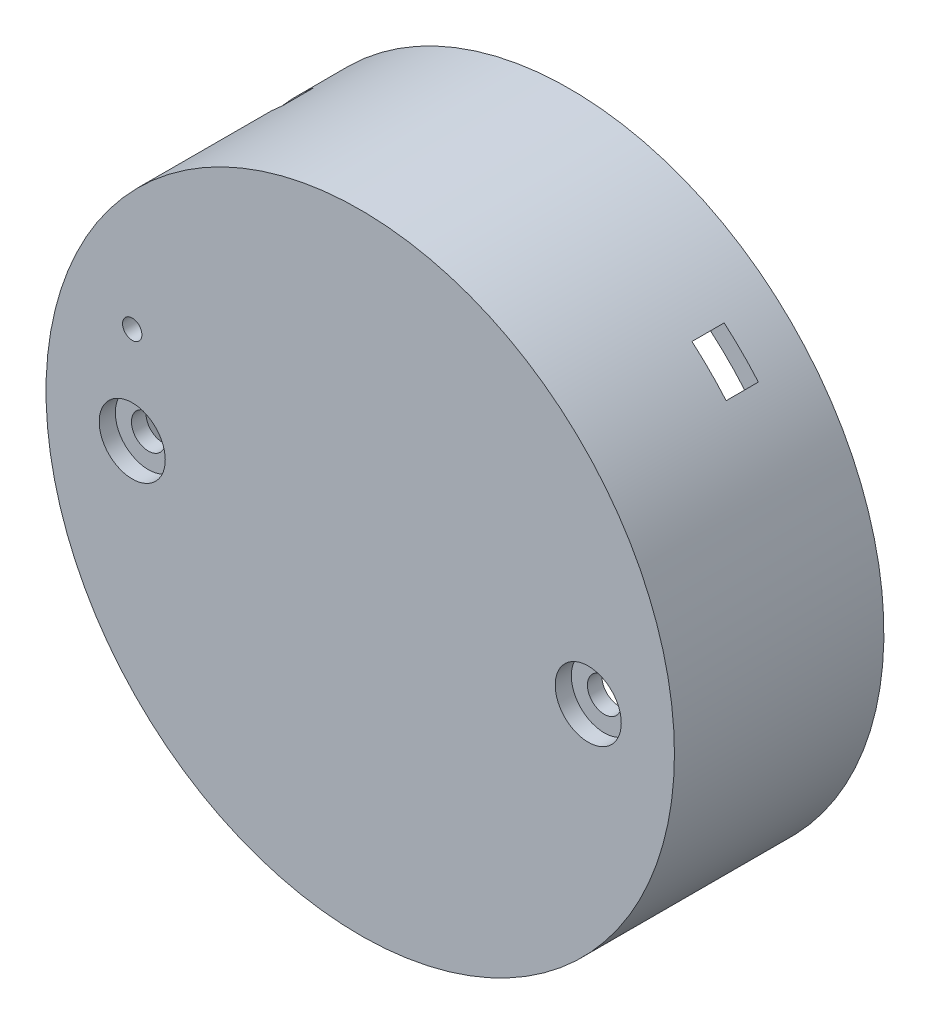
ISO-10303-21;
HEADER;
FILE_DESCRIPTION(('STEP AP214'),'2;1');
FILE_NAME('part.step','',(''),(''),'','','');
FILE_SCHEMA(('AUTOMOTIVE_DESIGN { 1 0 10303 214 1 1 1 1 }'));
ENDSEC;
DATA;
#1=APPLICATION_CONTEXT('core data for automotive mechanical design processes');
#2=APPLICATION_PROTOCOL_DEFINITION('international standard','automotive_design',2000,#1);
#3=PRODUCT_CONTEXT('',#1,'mechanical');
#4=PRODUCT('Part','Part','',(#3));
#5=PRODUCT_RELATED_PRODUCT_CATEGORY('part','',(#4));
#6=PRODUCT_DEFINITION_FORMATION('','',#4);
#7=PRODUCT_DEFINITION_CONTEXT('part definition',#1,'design');
#8=PRODUCT_DEFINITION('design','',#6,#7);
#9=PRODUCT_DEFINITION_SHAPE('','',#8);
#10=(LENGTH_UNIT() NAMED_UNIT(*) SI_UNIT(.MILLI.,.METRE.));
#11=(NAMED_UNIT(*) PLANE_ANGLE_UNIT() SI_UNIT($,.RADIAN.));
#12=(NAMED_UNIT(*) SI_UNIT($,.STERADIAN.) SOLID_ANGLE_UNIT());
#13=UNCERTAINTY_MEASURE_WITH_UNIT(LENGTH_MEASURE(1.E-05),#10,'distance_accuracy_value','');
#14=(GEOMETRIC_REPRESENTATION_CONTEXT(3) GLOBAL_UNCERTAINTY_ASSIGNED_CONTEXT((#13)) GLOBAL_UNIT_ASSIGNED_CONTEXT((#10,
#11,#12)) REPRESENTATION_CONTEXT('',''));
#15=CARTESIAN_POINT('',(0.,0.,0.));
#16=DIRECTION('',(0.,0.,1.));
#17=DIRECTION('',(1.,0.,0.));
#18=AXIS2_PLACEMENT_3D('',#15,#16,#17);
#19=CARTESIAN_POINT('',(5.21028005740604,9.53796523775199,13.));
#20=DIRECTION('',(0.,0.,-1.));
#21=DIRECTION('',(-1.,0.,0.));
#22=AXIS2_PLACEMENT_3D('',#19,#20,#21);
#23=CYLINDRICAL_SURFACE('',#22,19.5);
#24=CARTESIAN_POINT('',(5.21028005740604,9.53796523775199,5.1));
#25=DIRECTION('',(0.,0.,-1.));
#26=DIRECTION('',(-1.,0.,0.));
#27=AXIS2_PLACEMENT_3D('',#24,#25,#26);
#28=CIRCLE('',#27,19.5);
#29=CARTESIAN_POINT('',(-9.59810719924123,22.2250321508398,5.1));
#30=VERTEX_POINT('',#29);
#31=CARTESIAN_POINT('',(-7.47678685568157,24.3463524943994,5.1));
#32=VERTEX_POINT('',#31);
#33=EDGE_CURVE('E163',#30,#32,#28,.T.);
#34=ORIENTED_EDGE('',*,*,#33,.F.);
#35=DIRECTION('',(0.,0.,-1.));
#36=VECTOR('',#35,1.);
#37=CARTESIAN_POINT('',(-9.59810719924122,22.2250321508398,13.));
#38=LINE('',#37,#36);
#39=CARTESIAN_POINT('',(-9.59810719924123,22.2250321508398,3.1));
#40=VERTEX_POINT('',#39);
#41=EDGE_CURVE('E169',#40,#30,#38,.F.);
#42=ORIENTED_EDGE('',*,*,#41,.F.);
#43=CARTESIAN_POINT('',(5.21028005740604,9.53796523775199,3.1));
#44=DIRECTION('',(0.,0.,-1.));
#45=DIRECTION('',(-1.,0.,0.));
#46=AXIS2_PLACEMENT_3D('',#43,#44,#45);
#47=CIRCLE('',#46,19.5);
#48=CARTESIAN_POINT('',(-7.47678685568157,24.3463524943994,3.1));
#49=VERTEX_POINT('',#48);
#50=EDGE_CURVE('E154',#40,#49,#47,.T.);
#51=ORIENTED_EDGE('',*,*,#50,.T.);
#52=DIRECTION('',(0.,0.,-1.));
#53=VECTOR('',#52,1.);
#54=CARTESIAN_POINT('',(-7.47678685568157,24.3463524943994,13.));
#55=LINE('',#54,#53);
#56=EDGE_CURVE('E180',#49,#32,#55,.F.);
#57=ORIENTED_EDGE('',*,*,#56,.T.);
#58=EDGE_LOOP('',(#34,#42,#51,#57));
#59=FACE_BOUND('',#58,.T.);
#60=DIRECTION('',(0.,0.,-1.));
#61=VECTOR('',#60,1.);
#62=CARTESIAN_POINT('',(0.835300292869349,-9.46491749250487,13.));
#63=LINE('',#62,#61);
#64=CARTESIAN_POINT('',(0.835300292869347,-9.46491749250487,3.1));
#65=VERTEX_POINT('',#64);
#66=CARTESIAN_POINT('',(0.835300292869347,-9.46491749250487,6.35));
#67=VERTEX_POINT('',#66);
#68=EDGE_CURVE('E221',#65,#67,#63,.F.);
#69=ORIENTED_EDGE('',*,*,#68,.T.);
#70=CARTESIAN_POINT('',(5.21028005740604,9.53796523775199,6.35));
#71=DIRECTION('',(0.,0.,1.));
#72=DIRECTION('',(1.,0.,0.));
#73=AXIS2_PLACEMENT_3D('',#70,#71,#72);
#74=CIRCLE('',#73,19.5);
#75=CARTESIAN_POINT('',(9.58530029286935,-9.4649081749529,6.35));
#76=VERTEX_POINT('',#75);
#77=EDGE_CURVE('E218',#67,#76,#74,.T.);
#78=ORIENTED_EDGE('',*,*,#77,.T.);
#79=DIRECTION('',(0.,0.,-1.));
#80=VECTOR('',#79,1.);
#81=CARTESIAN_POINT('',(9.58530029286935,-9.4649081749529,13.));
#82=LINE('',#81,#80);
#83=CARTESIAN_POINT('',(9.58530029286935,-9.4649081749529,3.1));
#84=VERTEX_POINT('',#83);
#85=EDGE_CURVE('E225',#76,#84,#82,.T.);
#86=ORIENTED_EDGE('',*,*,#85,.T.);
#87=CARTESIAN_POINT('',(5.21028005740604,9.53796523775199,3.1));
#88=DIRECTION('',(0.,0.,1.));
#89=DIRECTION('',(1.,0.,0.));
#90=AXIS2_PLACEMENT_3D('',#87,#88,#89);
#91=CIRCLE('',#90,19.5);
#92=EDGE_CURVE('E209',#65,#84,#91,.T.);
#93=ORIENTED_EDGE('',*,*,#92,.F.);
#94=EDGE_LOOP('',(#69,#78,#86,#93));
#95=FACE_BOUND('',#94,.T.);
#96=CARTESIAN_POINT('',(5.21028005740604,9.53796523775199,13.));
#97=DIRECTION('',(0.,0.,1.));
#98=DIRECTION('',(1.,0.,0.));
#99=AXIS2_PLACEMENT_3D('',#96,#97,#98);
#100=CIRCLE('',#99,19.5);
#101=CARTESIAN_POINT('',(24.710280057406,9.53796523775199,13.));
#102=VERTEX_POINT('',#101);
#103=EDGE_CURVE('E475',#102,#102,#100,.T.);
#104=ORIENTED_EDGE('',*,*,#103,.F.);
#105=EDGE_LOOP('',(#104));
#106=FACE_BOUND('',#105,.T.);
#107=DIRECTION('',(0.,0.,-1.));
#108=VECTOR('',#107,1.);
#109=CARTESIAN_POINT('',(12.6846624627935,-8.47268737835367,1.5));
#110=LINE('',#109,#108);
#111=CARTESIAN_POINT('',(12.6846625511473,-8.47268740675363,0.));
#112=VERTEX_POINT('',#111);
#113=CARTESIAN_POINT('',(12.6846906677821,-8.47267567205894,1.5));
#114=VERTEX_POINT('',#113);
#115=EDGE_CURVE('E469',#112,#114,#110,.F.);
#116=ORIENTED_EDGE('',*,*,#115,.F.);
#117=CARTESIAN_POINT('',(5.21028005740604,9.53796523775199,0.));
#118=DIRECTION('',(0.,0.,1.));
#119=DIRECTION('',(1.,0.,0.));
#120=AXIS2_PLACEMENT_3D('',#117,#118,#119);
#121=CIRCLE('',#120,19.5);
#122=CARTESIAN_POINT('',(-2.26412115006537,-8.47267957551746,0.));
#123=VERTEX_POINT('',#122);
#124=EDGE_CURVE('E472',#112,#123,#121,.T.);
#125=ORIENTED_EDGE('',*,*,#124,.T.);
#126=DIRECTION('',(0.,0.,-1.));
#127=VECTOR('',#126,1.);
#128=CARTESIAN_POINT('',(-2.2641023477453,-8.4726873784516,1.5));
#129=LINE('',#128,#127);
#130=CARTESIAN_POINT('',(-2.2641024844062,-8.47268725665163,1.5));
#131=VERTEX_POINT('',#130);
#132=EDGE_CURVE('E301',#131,#123,#129,.T.);
#133=ORIENTED_EDGE('',*,*,#132,.F.);
#134=CARTESIAN_POINT('',(5.21028005740604,9.53796523775199,1.5));
#135=DIRECTION('',(0.,0.,1.));
#136=DIRECTION('',(1.,0.,0.));
#137=AXIS2_PLACEMENT_3D('',#134,#135,#136);
#138=CIRCLE('',#137,19.5);
#139=EDGE_CURVE('E328',#131,#114,#138,.T.);
#140=ORIENTED_EDGE('',*,*,#139,.T.);
#141=EDGE_LOOP('',(#116,#125,#133,#140));
#142=FACE_BOUND('',#141,.T.);
#143=CARTESIAN_POINT('',(5.21028005740604,9.53796523775199,5.1));
#144=DIRECTION('',(0.,0.,-1.));
#145=DIRECTION('',(-1.,0.,0.));
#146=AXIS2_PLACEMENT_3D('',#143,#144,#145);
#147=CIRCLE('',#146,19.5);
#148=CARTESIAN_POINT('',(17.8973469704938,24.3463524943993,5.1));
#149=VERTEX_POINT('',#148);
#150=CARTESIAN_POINT('',(20.0186673140535,22.2250321508396,5.1));
#151=VERTEX_POINT('',#150);
#152=EDGE_CURVE('E185',#149,#151,#147,.T.);
#153=ORIENTED_EDGE('',*,*,#152,.F.);
#154=DIRECTION('',(0.,0.,-1.));
#155=VECTOR('',#154,1.);
#156=CARTESIAN_POINT('',(17.8973469704938,24.3463524943993,13.));
#157=LINE('',#156,#155);
#158=CARTESIAN_POINT('',(17.8973469704938,24.3463524943993,3.1));
#159=VERTEX_POINT('',#158);
#160=EDGE_CURVE('E196',#159,#149,#157,.F.);
#161=ORIENTED_EDGE('',*,*,#160,.F.);
#162=CARTESIAN_POINT('',(5.21028005740604,9.53796523775199,3.1));
#163=DIRECTION('',(0.,0.,-1.));
#164=DIRECTION('',(-1.,0.,0.));
#165=AXIS2_PLACEMENT_3D('',#162,#163,#164);
#166=CIRCLE('',#165,19.5);
#167=CARTESIAN_POINT('',(20.0186673140535,22.2250321508396,3.1));
#168=VERTEX_POINT('',#167);
#169=EDGE_CURVE('E179',#159,#168,#166,.T.);
#170=ORIENTED_EDGE('',*,*,#169,.T.);
#171=DIRECTION('',(0.,0.,-1.));
#172=VECTOR('',#171,1.);
#173=CARTESIAN_POINT('',(20.0186673140535,22.2250321508396,13.));
#174=LINE('',#173,#172);
#175=EDGE_CURVE('E192',#168,#151,#174,.F.);
#176=ORIENTED_EDGE('',*,*,#175,.T.);
#177=EDGE_LOOP('',(#153,#161,#170,#176));
#178=FACE_BOUND('',#177,.T.);
#179=ADVANCED_FACE('F43',(#59,#95,#106,#142,#178),#23,.T.);
#180=CARTESIAN_POINT('',(5.21028005740604,9.53796523775199,1.5));
#181=DIRECTION('',(0.,0.,-1.));
#182=DIRECTION('',(-1.,0.,0.));
#183=AXIS2_PLACEMENT_3D('',#180,#181,#182);
#184=CYLINDRICAL_SURFACE('',#183,18.300000000007);
#185=CARTESIAN_POINT('',(5.21028005740604,9.53796523775199,6.35));
#186=DIRECTION('',(0.,0.,1.));
#187=DIRECTION('',(1.,0.,0.));
#188=AXIS2_PLACEMENT_3D('',#185,#186,#187);
#189=CIRCLE('',#188,18.300000000007);
#190=CARTESIAN_POINT('',(0.835300292869348,-8.23137780188093,6.35));
#191=VERTEX_POINT('',#190);
#192=CARTESIAN_POINT('',(9.58530029286935,-8.2313678375084,6.35));
#193=VERTEX_POINT('',#192);
#194=EDGE_CURVE('E363',#191,#193,#189,.T.);
#195=ORIENTED_EDGE('',*,*,#194,.F.);
#196=DIRECTION('',(0.,0.,-1.));
#197=VECTOR('',#196,1.);
#198=CARTESIAN_POINT('',(0.835300292869349,-8.23137780188093,1.5));
#199=LINE('',#198,#197);
#200=CARTESIAN_POINT('',(0.835300292869348,-8.23137780188093,3.1));
#201=VERTEX_POINT('',#200);
#202=EDGE_CURVE('E402',#201,#191,#199,.F.);
#203=ORIENTED_EDGE('',*,*,#202,.F.);
#204=CARTESIAN_POINT('',(5.21028005740604,9.53796523775199,3.1));
#205=DIRECTION('',(0.,0.,1.));
#206=DIRECTION('',(1.,0.,0.));
#207=AXIS2_PLACEMENT_3D('',#204,#205,#206);
#208=CIRCLE('',#207,18.300000000007);
#209=CARTESIAN_POINT('',(9.58530029286935,-8.2313678375084,3.1));
#210=VERTEX_POINT('',#209);
#211=EDGE_CURVE('E405',#201,#210,#208,.T.);
#212=ORIENTED_EDGE('',*,*,#211,.T.);
#213=DIRECTION('',(0.,0.,-1.));
#214=VECTOR('',#213,1.);
#215=CARTESIAN_POINT('',(9.58530029286935,-8.2313678375084,1.5));
#216=LINE('',#215,#214);
#217=EDGE_CURVE('E398',#193,#210,#216,.T.);
#218=ORIENTED_EDGE('',*,*,#217,.F.);
#219=EDGE_LOOP('',(#195,#203,#212,#218));
#220=FACE_BOUND('',#219,.T.);
#221=CARTESIAN_POINT('',(5.21028005740604,9.53796523775199,0.));
#222=DIRECTION('',(0.,0.,1.));
#223=DIRECTION('',(1.,0.,0.));
#224=AXIS2_PLACEMENT_3D('',#221,#222,#223);
#225=CIRCLE('',#224,18.300000000007);
#226=CARTESIAN_POINT('',(14.268164981837,-6.36312657054919,0.));
#227=VERTEX_POINT('',#226);
#228=CARTESIAN_POINT('',(-3.84760486638226,-6.36312657091527,0.));
#229=VERTEX_POINT('',#228);
#230=EDGE_CURVE('E266',#227,#229,#225,.T.);
#231=ORIENTED_EDGE('',*,*,#230,.F.);
#232=DIRECTION('',(0.,0.,-1.));
#233=VECTOR('',#232,1.);
#234=CARTESIAN_POINT('',(14.2693242463919,-6.3624661520644,1.5));
#235=LINE('',#234,#233);
#236=CARTESIAN_POINT('',(14.2685778762058,-6.36289130851979,1.5));
#237=VERTEX_POINT('',#236);
#238=EDGE_CURVE('E260',#237,#227,#235,.T.);
#239=ORIENTED_EDGE('',*,*,#238,.F.);
#240=CARTESIAN_POINT('',(5.21028005740604,9.53796523775199,1.5));
#241=DIRECTION('',(0.,0.,1.));
#242=DIRECTION('',(1.,0.,0.));
#243=AXIS2_PLACEMENT_3D('',#240,#241,#242);
#244=CIRCLE('',#243,18.300000000007);
#245=CARTESIAN_POINT('',(-3.8484869025287,-6.36262407108765,1.5));
#246=VERTEX_POINT('',#245);
#247=EDGE_CURVE('E256',#237,#246,#244,.F.);
#248=ORIENTED_EDGE('',*,*,#247,.T.);
#249=DIRECTION('',(0.,0.,-1.));
#250=VECTOR('',#249,1.);
#251=CARTESIAN_POINT('',(-3.84876413053498,-6.36246615265967,1.5));
#252=LINE('',#251,#250);
#253=EDGE_CURVE('E409',#229,#246,#252,.F.);
#254=ORIENTED_EDGE('',*,*,#253,.F.);
#255=EDGE_LOOP('',(#231,#239,#248,#254));
#256=FACE_BOUND('',#255,.T.);
#257=CARTESIAN_POINT('',(5.21028005740604,9.53796523775199,11.1));
#258=DIRECTION('',(0.,0.,1.));
#259=DIRECTION('',(1.,0.,0.));
#260=AXIS2_PLACEMENT_3D('',#257,#258,#259);
#261=CIRCLE('',#260,18.300000000007);
#262=CARTESIAN_POINT('',(23.510280057413,9.53796523775199,11.1));
#263=VERTEX_POINT('',#262);
#264=EDGE_CURVE('E252',#263,#263,#261,.T.);
#265=ORIENTED_EDGE('',*,*,#264,.T.);
#266=EDGE_LOOP('',(#265));
#267=FACE_BOUND('',#266,.T.);
#268=DIRECTION('',(0.,0.,-1.));
#269=VECTOR('',#268,1.);
#270=CARTESIAN_POINT('',(-8.74689127050149,21.3738162221,1.5));
#271=LINE('',#270,#269);
#272=CARTESIAN_POINT('',(-8.74689127050149,21.3738162221,3.1));
#273=VERTEX_POINT('',#272);
#274=CARTESIAN_POINT('',(-8.74689127050149,21.3738162221,5.1));
#275=VERTEX_POINT('',#274);
#276=EDGE_CURVE('E172',#273,#275,#271,.F.);
#277=ORIENTED_EDGE('',*,*,#276,.T.);
#278=CARTESIAN_POINT('',(5.21028005740604,9.53796523775199,5.1));
#279=DIRECTION('',(0.,0.,-1.));
#280=DIRECTION('',(-1.,0.,0.));
#281=AXIS2_PLACEMENT_3D('',#278,#279,#280);
#282=CIRCLE('',#281,18.300000000007);
#283=CARTESIAN_POINT('',(-6.62557092694184,23.4951365656597,5.1));
#284=VERTEX_POINT('',#283);
#285=EDGE_CURVE('E385',#275,#284,#282,.T.);
#286=ORIENTED_EDGE('',*,*,#285,.T.);
#287=DIRECTION('',(0.,0.,-1.));
#288=VECTOR('',#287,1.);
#289=CARTESIAN_POINT('',(-6.62557092694184,23.4951365656597,1.5));
#290=LINE('',#289,#288);
#291=CARTESIAN_POINT('',(-6.62557092694184,23.4951365656597,3.1));
#292=VERTEX_POINT('',#291);
#293=EDGE_CURVE('E390',#292,#284,#290,.F.);
#294=ORIENTED_EDGE('',*,*,#293,.F.);
#295=CARTESIAN_POINT('',(5.21028005740604,9.53796523775199,3.1));
#296=DIRECTION('',(0.,0.,-1.));
#297=DIRECTION('',(-1.,0.,0.));
#298=AXIS2_PLACEMENT_3D('',#295,#296,#297);
#299=CIRCLE('',#298,18.300000000007);
#300=EDGE_CURVE('E393',#273,#292,#299,.T.);
#301=ORIENTED_EDGE('',*,*,#300,.F.);
#302=EDGE_LOOP('',(#277,#286,#294,#301));
#303=FACE_BOUND('',#302,.T.);
#304=DIRECTION('',(0.,0.,-1.));
#305=VECTOR('',#304,1.);
#306=CARTESIAN_POINT('',(17.0461310417541,23.4951365656595,1.5));
#307=LINE('',#306,#305);
#308=CARTESIAN_POINT('',(17.0461310417541,23.4951365656595,3.1));
#309=VERTEX_POINT('',#308);
#310=CARTESIAN_POINT('',(17.0461310417541,23.4951365656595,5.1));
#311=VERTEX_POINT('',#310);
#312=EDGE_CURVE('E51',#309,#311,#307,.F.);
#313=ORIENTED_EDGE('',*,*,#312,.T.);
#314=CARTESIAN_POINT('',(5.21028005740604,9.53796523775199,5.1));
#315=DIRECTION('',(0.,0.,-1.));
#316=DIRECTION('',(-1.,0.,0.));
#317=AXIS2_PLACEMENT_3D('',#314,#315,#316);
#318=CIRCLE('',#317,18.300000000007);
#319=CARTESIAN_POINT('',(19.1674513853137,21.3738162220999,5.1));
#320=VERTEX_POINT('',#319);
#321=EDGE_CURVE('E11',#311,#320,#318,.T.);
#322=ORIENTED_EDGE('',*,*,#321,.T.);
#323=DIRECTION('',(0.,0.,-1.));
#324=VECTOR('',#323,1.);
#325=CARTESIAN_POINT('',(19.1674513853137,21.3738162220999,1.5));
#326=LINE('',#325,#324);
#327=CARTESIAN_POINT('',(19.1674513853137,21.3738162220999,3.1));
#328=VERTEX_POINT('',#327);
#329=EDGE_CURVE('E379',#328,#320,#326,.F.);
#330=ORIENTED_EDGE('',*,*,#329,.F.);
#331=CARTESIAN_POINT('',(5.21028005740604,9.53796523775199,3.1));
#332=DIRECTION('',(0.,0.,-1.));
#333=DIRECTION('',(-1.,0.,0.));
#334=AXIS2_PLACEMENT_3D('',#331,#332,#333);
#335=CIRCLE('',#334,18.300000000007);
#336=EDGE_CURVE('E374',#309,#328,#335,.T.);
#337=ORIENTED_EDGE('',*,*,#336,.F.);
#338=EDGE_LOOP('',(#313,#322,#330,#337));
#339=FACE_BOUND('',#338,.T.);
#340=ADVANCED_FACE('F289',(#220,#256,#267,#303,#339),#184,.F.);
#341=CARTESIAN_POINT('',(-8.93971994259747,9.53796523775199,13.));
#342=DIRECTION('',(0.,0.,-1.));
#343=DIRECTION('',(-1.,0.,0.));
#344=AXIS2_PLACEMENT_3D('',#341,#342,#343);
#345=CYLINDRICAL_SURFACE('',#344,1.05);
#346=CARTESIAN_POINT('',(-8.93971994259747,9.53796523775199,11.1));
#347=DIRECTION('',(0.,0.,1.));
#348=DIRECTION('',(1.,0.,0.));
#349=AXIS2_PLACEMENT_3D('',#346,#347,#348);
#350=CIRCLE('',#349,1.05);
#351=CARTESIAN_POINT('',(-9.98971994259747,9.53796523775199,11.1));
#352=VERTEX_POINT('',#351);
#353=EDGE_CURVE('E418',#352,#352,#350,.F.);
#354=CARTESIAN_POINT('',(-8.93971994259747,9.53796523775199,12.));
#355=DIRECTION('',(0.,0.,1.));
#356=DIRECTION('',(1.,0.,0.));
#357=AXIS2_PLACEMENT_3D('',#354,#355,#356);
#358=CIRCLE('',#357,1.05);
#359=CARTESIAN_POINT('',(-9.98971994259747,9.53796523775199,12.));
#360=VERTEX_POINT('',#359);
#361=EDGE_CURVE('E251',#360,#360,#358,.T.);
#362=CARTESIAN_POINT('',(-9.98971994259747,9.53796523775199,11.1));
#363=CARTESIAN_POINT('',(-9.98971994259747,9.53796523775199,11.109375));
#364=CARTESIAN_POINT('',(-9.98971994259747,9.53796523775199,11.11875));
#365=CARTESIAN_POINT('',(-9.98971994259747,9.53796523775199,11.1375));
#366=CARTESIAN_POINT('',(-9.98971994259747,9.53796523775199,11.146875));
#367=CARTESIAN_POINT('',(-9.98971994259747,9.53796523775199,11.165625));
#368=CARTESIAN_POINT('',(-9.98971994259747,9.53796523775199,11.175));
#369=CARTESIAN_POINT('',(-9.98971994259747,9.53796523775199,11.19375));
#370=CARTESIAN_POINT('',(-9.98971994259747,9.53796523775199,11.203125));
#371=CARTESIAN_POINT('',(-9.98971994259747,9.53796523775199,11.221875));
#372=CARTESIAN_POINT('',(-9.98971994259747,9.53796523775199,11.23125));
#373=CARTESIAN_POINT('',(-9.98971994259747,9.53796523775199,11.25));
#374=CARTESIAN_POINT('',(-9.98971994259747,9.53796523775199,11.259375));
#375=CARTESIAN_POINT('',(-9.98971994259747,9.53796523775199,11.278125));
#376=CARTESIAN_POINT('',(-9.98971994259747,9.53796523775199,11.2875));
#377=CARTESIAN_POINT('',(-9.98971994259747,9.53796523775199,11.30625));
#378=CARTESIAN_POINT('',(-9.98971994259747,9.53796523775199,11.315625));
#379=CARTESIAN_POINT('',(-9.98971994259747,9.53796523775199,11.334375));
#380=CARTESIAN_POINT('',(-9.98971994259747,9.53796523775199,11.34375));
#381=CARTESIAN_POINT('',(-9.98971994259747,9.53796523775199,11.3625));
#382=CARTESIAN_POINT('',(-9.98971994259747,9.53796523775199,11.371875));
#383=CARTESIAN_POINT('',(-9.98971994259747,9.53796523775199,11.390625));
#384=CARTESIAN_POINT('',(-9.98971994259747,9.53796523775199,11.4));
#385=CARTESIAN_POINT('',(-9.98971994259747,9.53796523775199,11.41875));
#386=CARTESIAN_POINT('',(-9.98971994259747,9.53796523775199,11.428125));
#387=CARTESIAN_POINT('',(-9.98971994259747,9.53796523775199,11.446875));
#388=CARTESIAN_POINT('',(-9.98971994259747,9.53796523775199,11.45625));
#389=CARTESIAN_POINT('',(-9.98971994259747,9.53796523775199,11.475));
#390=CARTESIAN_POINT('',(-9.98971994259747,9.53796523775199,11.484375));
#391=CARTESIAN_POINT('',(-9.98971994259747,9.53796523775199,11.503125));
#392=CARTESIAN_POINT('',(-9.98971994259747,9.53796523775199,11.5125));
#393=CARTESIAN_POINT('',(-9.98971994259747,9.53796523775199,11.53125));
#394=CARTESIAN_POINT('',(-9.98971994259747,9.53796523775199,11.540625));
#395=CARTESIAN_POINT('',(-9.98971994259747,9.53796523775199,11.559375));
#396=CARTESIAN_POINT('',(-9.98971994259747,9.53796523775199,11.56875));
#397=CARTESIAN_POINT('',(-9.98971994259747,9.53796523775199,11.5875));
#398=CARTESIAN_POINT('',(-9.98971994259747,9.53796523775199,11.596875));
#399=CARTESIAN_POINT('',(-9.98971994259747,9.53796523775199,11.615625));
#400=CARTESIAN_POINT('',(-9.98971994259747,9.53796523775199,11.625));
#401=CARTESIAN_POINT('',(-9.98971994259747,9.53796523775199,11.64375));
#402=CARTESIAN_POINT('',(-9.98971994259747,9.53796523775199,11.653125));
#403=CARTESIAN_POINT('',(-9.98971994259747,9.53796523775199,11.671875));
#404=CARTESIAN_POINT('',(-9.98971994259747,9.53796523775199,11.68125));
#405=CARTESIAN_POINT('',(-9.98971994259747,9.53796523775199,11.7));
#406=CARTESIAN_POINT('',(-9.98971994259747,9.53796523775199,11.709375));
#407=CARTESIAN_POINT('',(-9.98971994259747,9.53796523775199,11.728125));
#408=CARTESIAN_POINT('',(-9.98971994259747,9.53796523775199,11.7375));
#409=CARTESIAN_POINT('',(-9.98971994259747,9.53796523775199,11.75625));
#410=CARTESIAN_POINT('',(-9.98971994259747,9.53796523775199,11.765625));
#411=CARTESIAN_POINT('',(-9.98971994259747,9.53796523775199,11.784375));
#412=CARTESIAN_POINT('',(-9.98971994259747,9.53796523775199,11.79375));
#413=CARTESIAN_POINT('',(-9.98971994259747,9.53796523775199,11.8125));
#414=CARTESIAN_POINT('',(-9.98971994259747,9.53796523775199,11.821875));
#415=CARTESIAN_POINT('',(-9.98971994259747,9.53796523775199,11.840625));
#416=CARTESIAN_POINT('',(-9.98971994259747,9.53796523775199,11.85));
#417=CARTESIAN_POINT('',(-9.98971994259747,9.53796523775199,11.86875));
#418=CARTESIAN_POINT('',(-9.98971994259747,9.53796523775199,11.878125));
#419=CARTESIAN_POINT('',(-9.98971994259747,9.53796523775199,11.896875));
#420=CARTESIAN_POINT('',(-9.98971994259747,9.53796523775199,11.90625));
#421=CARTESIAN_POINT('',(-9.98971994259747,9.53796523775199,11.925));
#422=CARTESIAN_POINT('',(-9.98971994259747,9.53796523775199,11.934375));
#423=CARTESIAN_POINT('',(-9.98971994259747,9.53796523775199,11.953125));
#424=CARTESIAN_POINT('',(-9.98971994259747,9.53796523775199,11.9625));
#425=CARTESIAN_POINT('',(-9.98971994259747,9.53796523775199,11.98125));
#426=CARTESIAN_POINT('',(-9.98971994259747,9.53796523775199,11.990625));
#427=CARTESIAN_POINT('',(-9.98971994259747,9.53796523775199,12.));
#428=B_SPLINE_CURVE_WITH_KNOTS('',3,(#362,#363,#364,#365,#366,#367,#368,#369,#370,#371,#372,
#373,#374,#375,#376,#377,#378,#379,#380,#381,#382,#383,#384,#385,#386,#387,#388,#389,#390,#391,
#392,#393,#394,#395,#396,#397,#398,#399,#400,#401,#402,#403,#404,#405,#406,#407,#408,#409,#410,
#411,#412,#413,#414,#415,#416,#417,#418,#419,#420,#421,#422,#423,#424,#425,#426,#427),
.UNSPECIFIED.,.F.,.F.,(4,2,2,2,2,2,2,2,2,2,2,2,2,2,2,2,2,2,2,2,2,2,2,2,2,2,2,2,2,2,2,2,4),(0.,
0.0281249999999986,0.056249999999999,0.0843749999999994,0.1125,0.140625,0.168749999999999,
0.196874999999999,0.225,0.253125,0.281249999999999,0.309374999999999,0.337499999999999,0.365625,
0.393749999999998,0.421874999999999,0.449999999999999,0.478124999999999,0.50625,
0.534374999999998,0.562499999999999,0.590624999999999,0.618749999999999,0.646874999999998,
0.674999999999998,0.703124999999999,0.731249999999999,0.759374999999998,0.787499999999998,
0.815624999999999,0.843749999999999,0.871874999999999,0.899999999999998),.UNSPECIFIED.);
#429=EDGE_CURVE('BSEAM346',#352,#360,#428,.T.);
#430=ORIENTED_EDGE('',*,*,#353,.T.);
#431=ORIENTED_EDGE('',*,*,#361,.T.);
#432=ORIENTED_EDGE('',*,*,#429,.T.);
#433=ORIENTED_EDGE('',*,*,#429,.F.);
#434=EDGE_LOOP('',(#430,#432,#431,#433));
#435=FACE_BOUND('',#434,.T.);
#436=ADVANCED_FACE('F346',(#435),#345,.F.);
#437=CARTESIAN_POINT('',(19.3602800574095,9.53796523775199,13.));
#438=DIRECTION('',(0.,0.,-1.));
#439=DIRECTION('',(-1.,0.,0.));
#440=AXIS2_PLACEMENT_3D('',#437,#438,#439);
#441=CYLINDRICAL_SURFACE('',#440,1.05);
#442=CARTESIAN_POINT('',(19.3602800574095,9.53796523775199,11.1));
#443=DIRECTION('',(0.,0.,1.));
#444=DIRECTION('',(1.,0.,0.));
#445=AXIS2_PLACEMENT_3D('',#442,#443,#444);
#446=CIRCLE('',#445,1.05);
#447=CARTESIAN_POINT('',(18.3102800574095,9.53796523775199,11.1));
#448=VERTEX_POINT('',#447);
#449=EDGE_CURVE('E257',#448,#448,#446,.F.);
#450=CARTESIAN_POINT('',(19.3602800574095,9.53796523775199,12.));
#451=DIRECTION('',(0.,0.,1.));
#452=DIRECTION('',(1.,0.,0.));
#453=AXIS2_PLACEMENT_3D('',#450,#451,#452);
#454=CIRCLE('',#453,1.05);
#455=CARTESIAN_POINT('',(18.3102800574095,9.53796523775199,12.));
#456=VERTEX_POINT('',#455);
#457=EDGE_CURVE('E234',#456,#456,#454,.T.);
#458=CARTESIAN_POINT('',(18.3102800574095,9.53796523775199,11.1));
#459=CARTESIAN_POINT('',(18.3102800574095,9.53796523775199,11.109375));
#460=CARTESIAN_POINT('',(18.3102800574095,9.53796523775199,11.11875));
#461=CARTESIAN_POINT('',(18.3102800574095,9.53796523775199,11.1375));
#462=CARTESIAN_POINT('',(18.3102800574095,9.53796523775199,11.146875));
#463=CARTESIAN_POINT('',(18.3102800574095,9.53796523775199,11.165625));
#464=CARTESIAN_POINT('',(18.3102800574095,9.53796523775199,11.175));
#465=CARTESIAN_POINT('',(18.3102800574095,9.53796523775199,11.19375));
#466=CARTESIAN_POINT('',(18.3102800574095,9.53796523775199,11.203125));
#467=CARTESIAN_POINT('',(18.3102800574095,9.53796523775199,11.221875));
#468=CARTESIAN_POINT('',(18.3102800574095,9.53796523775199,11.23125));
#469=CARTESIAN_POINT('',(18.3102800574095,9.53796523775199,11.25));
#470=CARTESIAN_POINT('',(18.3102800574095,9.53796523775199,11.259375));
#471=CARTESIAN_POINT('',(18.3102800574095,9.53796523775199,11.278125));
#472=CARTESIAN_POINT('',(18.3102800574095,9.53796523775199,11.2875));
#473=CARTESIAN_POINT('',(18.3102800574095,9.53796523775199,11.30625));
#474=CARTESIAN_POINT('',(18.3102800574095,9.53796523775199,11.315625));
#475=CARTESIAN_POINT('',(18.3102800574095,9.53796523775199,11.334375));
#476=CARTESIAN_POINT('',(18.3102800574095,9.53796523775199,11.34375));
#477=CARTESIAN_POINT('',(18.3102800574095,9.53796523775199,11.3625));
#478=CARTESIAN_POINT('',(18.3102800574095,9.53796523775199,11.371875));
#479=CARTESIAN_POINT('',(18.3102800574095,9.53796523775199,11.390625));
#480=CARTESIAN_POINT('',(18.3102800574095,9.53796523775199,11.4));
#481=CARTESIAN_POINT('',(18.3102800574095,9.53796523775199,11.41875));
#482=CARTESIAN_POINT('',(18.3102800574095,9.53796523775199,11.428125));
#483=CARTESIAN_POINT('',(18.3102800574095,9.53796523775199,11.446875));
#484=CARTESIAN_POINT('',(18.3102800574095,9.53796523775199,11.45625));
#485=CARTESIAN_POINT('',(18.3102800574095,9.53796523775199,11.475));
#486=CARTESIAN_POINT('',(18.3102800574095,9.53796523775199,11.484375));
#487=CARTESIAN_POINT('',(18.3102800574095,9.53796523775199,11.503125));
#488=CARTESIAN_POINT('',(18.3102800574095,9.53796523775199,11.5125));
#489=CARTESIAN_POINT('',(18.3102800574095,9.53796523775199,11.53125));
#490=CARTESIAN_POINT('',(18.3102800574095,9.53796523775199,11.540625));
#491=CARTESIAN_POINT('',(18.3102800574095,9.53796523775199,11.559375));
#492=CARTESIAN_POINT('',(18.3102800574095,9.53796523775199,11.56875));
#493=CARTESIAN_POINT('',(18.3102800574095,9.53796523775199,11.5875));
#494=CARTESIAN_POINT('',(18.3102800574095,9.53796523775199,11.596875));
#495=CARTESIAN_POINT('',(18.3102800574095,9.53796523775199,11.615625));
#496=CARTESIAN_POINT('',(18.3102800574095,9.53796523775199,11.625));
#497=CARTESIAN_POINT('',(18.3102800574095,9.53796523775199,11.64375));
#498=CARTESIAN_POINT('',(18.3102800574095,9.53796523775199,11.653125));
#499=CARTESIAN_POINT('',(18.3102800574095,9.53796523775199,11.671875));
#500=CARTESIAN_POINT('',(18.3102800574095,9.53796523775199,11.68125));
#501=CARTESIAN_POINT('',(18.3102800574095,9.53796523775199,11.7));
#502=CARTESIAN_POINT('',(18.3102800574095,9.53796523775199,11.709375));
#503=CARTESIAN_POINT('',(18.3102800574095,9.53796523775199,11.728125));
#504=CARTESIAN_POINT('',(18.3102800574095,9.53796523775199,11.7375));
#505=CARTESIAN_POINT('',(18.3102800574095,9.53796523775199,11.75625));
#506=CARTESIAN_POINT('',(18.3102800574095,9.53796523775199,11.765625));
#507=CARTESIAN_POINT('',(18.3102800574095,9.53796523775199,11.784375));
#508=CARTESIAN_POINT('',(18.3102800574095,9.53796523775199,11.79375));
#509=CARTESIAN_POINT('',(18.3102800574095,9.53796523775199,11.8125));
#510=CARTESIAN_POINT('',(18.3102800574095,9.53796523775199,11.821875));
#511=CARTESIAN_POINT('',(18.3102800574095,9.53796523775199,11.840625));
#512=CARTESIAN_POINT('',(18.3102800574095,9.53796523775199,11.85));
#513=CARTESIAN_POINT('',(18.3102800574095,9.53796523775199,11.86875));
#514=CARTESIAN_POINT('',(18.3102800574095,9.53796523775199,11.878125));
#515=CARTESIAN_POINT('',(18.3102800574095,9.53796523775199,11.896875));
#516=CARTESIAN_POINT('',(18.3102800574095,9.53796523775199,11.90625));
#517=CARTESIAN_POINT('',(18.3102800574095,9.53796523775199,11.925));
#518=CARTESIAN_POINT('',(18.3102800574095,9.53796523775199,11.934375));
#519=CARTESIAN_POINT('',(18.3102800574095,9.53796523775199,11.953125));
#520=CARTESIAN_POINT('',(18.3102800574095,9.53796523775199,11.9625));
#521=CARTESIAN_POINT('',(18.3102800574095,9.53796523775199,11.98125));
#522=CARTESIAN_POINT('',(18.3102800574095,9.53796523775199,11.990625));
#523=CARTESIAN_POINT('',(18.3102800574095,9.53796523775199,12.));
#524=B_SPLINE_CURVE_WITH_KNOTS('',3,(#458,#459,#460,#461,#462,#463,#464,#465,#466,#467,#468,
#469,#470,#471,#472,#473,#474,#475,#476,#477,#478,#479,#480,#481,#482,#483,#484,#485,#486,#487,
#488,#489,#490,#491,#492,#493,#494,#495,#496,#497,#498,#499,#500,#501,#502,#503,#504,#505,#506,
#507,#508,#509,#510,#511,#512,#513,#514,#515,#516,#517,#518,#519,#520,#521,#522,#523),
.UNSPECIFIED.,.F.,.F.,(4,2,2,2,2,2,2,2,2,2,2,2,2,2,2,2,2,2,2,2,2,2,2,2,2,2,2,2,2,2,2,2,4),(0.,
0.0281249999999986,0.056249999999999,0.0843749999999994,0.1125,0.140625,0.168749999999999,
0.196874999999999,0.225,0.253125,0.281249999999999,0.309374999999999,0.337499999999999,0.365625,
0.393749999999998,0.421874999999999,0.449999999999999,0.478124999999999,0.50625,
0.534374999999998,0.562499999999999,0.590624999999999,0.618749999999999,0.646874999999998,
0.674999999999998,0.703124999999999,0.731249999999999,0.759374999999998,0.787499999999998,
0.815624999999999,0.843749999999999,0.871874999999999,0.899999999999998),.UNSPECIFIED.);
#525=EDGE_CURVE('BSEAM338',#448,#456,#524,.T.);
#526=ORIENTED_EDGE('',*,*,#449,.T.);
#527=ORIENTED_EDGE('',*,*,#457,.T.);
#528=ORIENTED_EDGE('',*,*,#525,.T.);
#529=ORIENTED_EDGE('',*,*,#525,.F.);
#530=EDGE_LOOP('',(#526,#528,#527,#529));
#531=FACE_BOUND('',#530,.T.);
#532=ADVANCED_FACE('F338',(#531),#441,.F.);
#533=CARTESIAN_POINT('',(5.21028005740604,9.53796523775199,0.));
#534=DIRECTION('',(0.,0.,1.));
#535=DIRECTION('',(1.,0.,0.));
#536=AXIS2_PLACEMENT_3D('',#533,#534,#535);
#537=PLANE('',#536);
#538=CARTESIAN_POINT('',(14.2682782233129,-6.36327344046864,0.));
#539=CARTESIAN_POINT('',(13.8793569153479,-6.66349322372944,0.));
#540=CARTESIAN_POINT('',(13.5573125921802,-6.98159275696327,0.));
#541=CARTESIAN_POINT('',(13.0204376062899,-7.68086334917129,0.));
#542=CARTESIAN_POINT('',(12.8159405845984,-8.0645862526628,0.));
#543=CARTESIAN_POINT('',(12.6846624627967,-8.47268737834384,0.));
#544=B_SPLINE_CURVE_WITH_KNOTS('',3,(#538,#539,#540,#541,#542,#543),.UNSPECIFIED.,.F.,.F.,(4,2,
4),(0.219063277587498,0.476741070348272,0.757677792760774),.UNSPECIFIED.);
#545=EDGE_CURVE('E312',#227,#112,#544,.T.);
#546=ORIENTED_EDGE('',*,*,#545,.F.);
#547=ORIENTED_EDGE('',*,*,#230,.T.);
#548=CARTESIAN_POINT('',(-2.26410638575335,-8.47267482567299,0.));
#549=CARTESIAN_POINT('',(-2.39538466301911,-8.06457838394219,0.));
#550=CARTESIAN_POINT('',(-2.59988036254454,-7.68085960927547,0.));
#551=CARTESIAN_POINT('',(-3.13675248576298,-6.98159274580006,0.));
#552=CARTESIAN_POINT('',(-3.45879682140306,-6.66349320289974,0.));
#553=CARTESIAN_POINT('',(-3.84771814618686,-6.36327341116669,0.));
#554=B_SPLINE_CURVE_WITH_KNOTS('',3,(#548,#549,#550,#551,#552,#553),.UNSPECIFIED.,.F.,.F.,(4,2,
4),(0.24232219903089,0.523256041065128,0.780933842034239),.UNSPECIFIED.);
#555=EDGE_CURVE('E487',#229,#123,#554,.F.);
#556=ORIENTED_EDGE('',*,*,#555,.T.);
#557=ORIENTED_EDGE('',*,*,#124,.F.);
#558=EDGE_LOOP('',(#546,#547,#556,#557));
#559=FACE_BOUND('',#558,.T.);
#560=ADVANCED_FACE('F330',(#559),#537,.F.);
#561=CARTESIAN_POINT('',(13.3004670051128,-7.31612979164514,1.5));
#562=DIRECTION('',(0.,0.,1.));
#563=DIRECTION('',(1.,0.,0.));
#564=AXIS2_PLACEMENT_3D('',#561,#562,#563);
#565=PLANE('',#564);
#566=ORIENTED_EDGE('',*,*,#247,.F.);
#567=CARTESIAN_POINT('',(12.6846665020685,-8.47267482163687,1.5));
#568=CARTESIAN_POINT('',(12.8159447793359,-8.06457838157811,1.5));
#569=CARTESIAN_POINT('',(13.0204404783307,-7.6808596083867,1.5));
#570=CARTESIAN_POINT('',(13.5573946105989,-6.98148592935968,1.5));
#571=CARTESIAN_POINT('',(13.8795625986164,-6.6632900681625,1.5));
#572=CARTESIAN_POINT('',(14.2686508261198,-6.36298583867814,1.5));
#573=B_SPLINE_CURVE_WITH_KNOTS('',3,(#567,#568,#569,#570,#571,#572),.UNSPECIFIED.,.F.,.F.,(4,2,
4),(0.219066158934006,0.5,0.757760076927385),.UNSPECIFIED.);
#574=EDGE_CURVE('E465',#114,#237,#573,.T.);
#575=ORIENTED_EDGE('',*,*,#574,.F.);
#576=ORIENTED_EDGE('',*,*,#139,.F.);
#577=CARTESIAN_POINT('',(-3.84826386135386,-6.36285220321058,1.5));
#578=CARTESIAN_POINT('',(-3.45909806256125,-6.66319566939266,1.5));
#579=CARTESIAN_POINT('',(-3.13687260711478,-6.98143628977027,1.5));
#580=CARTESIAN_POINT('',(-2.59987752576069,-7.68086330413847,1.5));
#581=CARTESIAN_POINT('',(-2.39538051977585,-8.06458615840201,1.5));
#582=CARTESIAN_POINT('',(-2.26410239606714,-8.47268722823468,1.5));
#583=B_SPLINE_CURVE_WITH_KNOTS('',3,(#577,#578,#579,#580,#581,#582),.UNSPECIFIED.,.F.,.F.,(4,2,
4),(0.242201688473812,0.5,0.780936688009553),.UNSPECIFIED.);
#584=EDGE_CURVE('E494',#246,#131,#583,.T.);
#585=ORIENTED_EDGE('',*,*,#584,.F.);
#586=EDGE_LOOP('',(#566,#575,#576,#585));
#587=FACE_BOUND('',#586,.T.);
#588=ADVANCED_FACE('F287',(#587),#565,.F.);
#589=CARTESIAN_POINT('',(12.5100262235026,-9.4743731582376,1.5));
#590=CARTESIAN_POINT('',(12.5429489515341,-8.67455597184634,1.5));
#591=CARTESIAN_POINT('',(12.8020818235348,-7.9652680644812,1.5));
#592=CARTESIAN_POINT('',(13.7988521866909,-6.66699151880909,1.5));
#593=CARTESIAN_POINT('',(14.5427225049327,-6.07974343788074,1.5));
#594=CARTESIAN_POINT('',(15.5443392270332,-5.56492260129852,1.5));
#595=B_SPLINE_CURVE_WITH_KNOTS('',3,(#589,#590,#591,#592,#593,#594),.UNSPECIFIED.,.F.,.F.,(4,2,
4),(0.,0.5,1.),.UNSPECIFIED.);
#596=DIRECTION('',(0.,0.,-1.));
#597=VECTOR('',#596,1.);
#598=SURFACE_OF_LINEAR_EXTRUSION('',#595,#597);
#599=ORIENTED_EDGE('',*,*,#574,.T.);
#600=ORIENTED_EDGE('',*,*,#238,.T.);
#601=ORIENTED_EDGE('',*,*,#545,.T.);
#602=ORIENTED_EDGE('',*,*,#115,.T.);
#603=EDGE_LOOP('',(#599,#600,#601,#602));
#604=FACE_BOUND('',#603,.T.);
#605=ADVANCED_FACE('F281',(#604),#598,.T.);
#606=CARTESIAN_POINT('',(-5.12377911330311,-5.56492260057638,1.5));
#607=CARTESIAN_POINT('',(-4.12216239075482,-6.07974343721801,1.5));
#608=CARTESIAN_POINT('',(-3.37829207219162,-6.66699151824037,1.5));
#609=CARTESIAN_POINT('',(-2.38152170862354,-7.96526806416914,1.5));
#610=CARTESIAN_POINT('',(-2.12238883651062,-8.67455597171098,1.5));
#611=CARTESIAN_POINT('',(-2.08946610849423,-9.4743731582983,1.5));
#612=B_SPLINE_CURVE_WITH_KNOTS('',3,(#606,#607,#608,#609,#610,#611),.UNSPECIFIED.,.F.,.F.,(4,2,
4),(0.,0.5,1.),.UNSPECIFIED.);
#613=DIRECTION('',(0.,0.,-1.));
#614=VECTOR('',#613,1.);
#615=SURFACE_OF_LINEAR_EXTRUSION('',#612,#614);
#616=ORIENTED_EDGE('',*,*,#555,.F.);
#617=ORIENTED_EDGE('',*,*,#253,.T.);
#618=ORIENTED_EDGE('',*,*,#584,.T.);
#619=ORIENTED_EDGE('',*,*,#132,.T.);
#620=EDGE_LOOP('',(#616,#617,#618,#619));
#621=FACE_BOUND('',#620,.T.);
#622=ADVANCED_FACE('F286',(#621),#615,.T.);
#623=CARTESIAN_POINT('',(5.21028005740604,9.53796523775199,13.));
#624=DIRECTION('',(0.,0.,1.));
#625=DIRECTION('',(1.,0.,0.));
#626=AXIS2_PLACEMENT_3D('',#623,#624,#625);
#627=PLANE('',#626);
#628=CARTESIAN_POINT('',(-8.93971994259747,9.53796523775199,13.));
#629=DIRECTION('',(0.,0.,1.));
#630=DIRECTION('',(1.,0.,0.));
#631=AXIS2_PLACEMENT_3D('',#628,#629,#630);
#632=CIRCLE('',#631,2.05);
#633=CARTESIAN_POINT('',(-6.88971994259747,9.53796523775199,13.));
#634=VERTEX_POINT('',#633);
#635=EDGE_CURVE('E235',#634,#634,#632,.T.);
#636=ORIENTED_EDGE('',*,*,#635,.F.);
#637=EDGE_LOOP('',(#636));
#638=FACE_BOUND('',#637,.T.);
#639=CARTESIAN_POINT('',(19.3602800574095,9.53796523775199,13.));
#640=DIRECTION('',(0.,0.,1.));
#641=DIRECTION('',(1.,0.,0.));
#642=AXIS2_PLACEMENT_3D('',#639,#640,#641);
#643=CIRCLE('',#642,2.05);
#644=CARTESIAN_POINT('',(21.4102800574095,9.53796523775199,13.));
#645=VERTEX_POINT('',#644);
#646=EDGE_CURVE('E239',#645,#645,#643,.T.);
#647=ORIENTED_EDGE('',*,*,#646,.F.);
#648=EDGE_LOOP('',(#647));
#649=FACE_BOUND('',#648,.T.);
#650=CARTESIAN_POINT('',(-8.93971994259747,15.537965237752,13.));
#651=DIRECTION('',(0.,0.,1.));
#652=DIRECTION('',(1.,0.,0.));
#653=AXIS2_PLACEMENT_3D('',#650,#651,#652);
#654=CIRCLE('',#653,0.6);
#655=CARTESIAN_POINT('',(-8.33971994259747,15.537965237752,13.));
#656=VERTEX_POINT('',#655);
#657=EDGE_CURVE('E246',#656,#656,#654,.T.);
#658=ORIENTED_EDGE('',*,*,#657,.F.);
#659=EDGE_LOOP('',(#658));
#660=FACE_BOUND('',#659,.T.);
#661=ORIENTED_EDGE('',*,*,#103,.T.);
#662=EDGE_LOOP('',(#661));
#663=FACE_BOUND('',#662,.T.);
#664=ADVANCED_FACE('F291',(#638,#649,#660,#663),#627,.T.);
#665=CARTESIAN_POINT('',(5.21028005740604,9.53796523775199,11.1));
#666=DIRECTION('',(0.,0.,1.));
#667=DIRECTION('',(1.,0.,0.));
#668=AXIS2_PLACEMENT_3D('',#665,#666,#667);
#669=PLANE('',#668);
#670=ORIENTED_EDGE('',*,*,#449,.F.);
#671=EDGE_LOOP('',(#670));
#672=FACE_BOUND('',#671,.T.);
#673=ORIENTED_EDGE('',*,*,#353,.F.);
#674=EDGE_LOOP('',(#673));
#675=FACE_BOUND('',#674,.T.);
#676=CARTESIAN_POINT('',(-8.93971994259747,15.537965237752,11.1));
#677=DIRECTION('',(0.,0.,1.));
#678=DIRECTION('',(1.,0.,0.));
#679=AXIS2_PLACEMENT_3D('',#676,#677,#678);
#680=CIRCLE('',#679,0.6);
#681=CARTESIAN_POINT('',(-8.33971994259747,15.537965237752,11.1));
#682=VERTEX_POINT('',#681);
#683=EDGE_CURVE('E250',#682,#682,#680,.F.);
#684=ORIENTED_EDGE('',*,*,#683,.F.);
#685=EDGE_LOOP('',(#684));
#686=FACE_BOUND('',#685,.T.);
#687=ORIENTED_EDGE('',*,*,#264,.F.);
#688=EDGE_LOOP('',(#687));
#689=FACE_BOUND('',#688,.T.);
#690=ADVANCED_FACE('F428',(#672,#675,#686,#689),#669,.F.);
#691=CARTESIAN_POINT('',(-8.93971994259747,15.537965237752,13.));
#692=DIRECTION('',(0.,0.,-1.));
#693=DIRECTION('',(-1.,0.,0.));
#694=AXIS2_PLACEMENT_3D('',#691,#692,#693);
#695=CYLINDRICAL_SURFACE('',#694,0.6);
#696=ORIENTED_EDGE('',*,*,#657,.T.);
#697=EDGE_LOOP('',(#696));
#698=FACE_BOUND('',#697,.T.);
#699=ORIENTED_EDGE('',*,*,#683,.T.);
#700=EDGE_LOOP('',(#699));
#701=FACE_BOUND('',#700,.T.);
#702=ADVANCED_FACE('F426',(#698,#701),#695,.F.);
#703=CARTESIAN_POINT('',(19.3602800574095,9.53796523775199,12.));
#704=DIRECTION('',(0.,0.,1.));
#705=DIRECTION('',(1.,0.,0.));
#706=AXIS2_PLACEMENT_3D('',#703,#704,#705);
#707=CYLINDRICAL_SURFACE('',#706,2.05);
#708=CARTESIAN_POINT('',(19.3602800574095,9.53796523775199,12.));
#709=DIRECTION('',(0.,0.,1.));
#710=DIRECTION('',(1.,0.,0.));
#711=AXIS2_PLACEMENT_3D('',#708,#709,#710);
#712=CIRCLE('',#711,2.05);
#713=CARTESIAN_POINT('',(21.4102800574095,9.53796523775199,12.));
#714=VERTEX_POINT('',#713);
#715=EDGE_CURVE('E229',#714,#714,#712,.T.);
#716=ORIENTED_EDGE('',*,*,#715,.F.);
#717=EDGE_LOOP('',(#716));
#718=FACE_BOUND('',#717,.T.);
#719=ORIENTED_EDGE('',*,*,#646,.T.);
#720=EDGE_LOOP('',(#719));
#721=FACE_BOUND('',#720,.T.);
#722=ADVANCED_FACE('F437',(#718,#721),#707,.F.);
#723=CARTESIAN_POINT('',(19.3602800574095,9.53796523775199,12.));
#724=DIRECTION('',(0.,0.,1.));
#725=DIRECTION('',(1.,0.,0.));
#726=AXIS2_PLACEMENT_3D('',#723,#724,#725);
#727=PLANE('',#726);
#728=ORIENTED_EDGE('',*,*,#457,.F.);
#729=EDGE_LOOP('',(#728));
#730=FACE_BOUND('',#729,.T.);
#731=ORIENTED_EDGE('',*,*,#715,.T.);
#732=EDGE_LOOP('',(#731));
#733=FACE_BOUND('',#732,.T.);
#734=ADVANCED_FACE('F543',(#730,#733),#727,.T.);
#735=CARTESIAN_POINT('',(-8.93971994259747,9.53796523775199,12.));
#736=DIRECTION('',(0.,0.,1.));
#737=DIRECTION('',(1.,0.,0.));
#738=AXIS2_PLACEMENT_3D('',#735,#736,#737);
#739=CYLINDRICAL_SURFACE('',#738,2.05);
#740=CARTESIAN_POINT('',(-8.93971994259747,9.53796523775199,12.));
#741=DIRECTION('',(0.,0.,1.));
#742=DIRECTION('',(1.,0.,0.));
#743=AXIS2_PLACEMENT_3D('',#740,#741,#742);
#744=CIRCLE('',#743,2.05);
#745=CARTESIAN_POINT('',(-6.88971994259747,9.53796523775199,12.));
#746=VERTEX_POINT('',#745);
#747=EDGE_CURVE('E230',#746,#746,#744,.T.);
#748=ORIENTED_EDGE('',*,*,#747,.F.);
#749=EDGE_LOOP('',(#748));
#750=FACE_BOUND('',#749,.T.);
#751=ORIENTED_EDGE('',*,*,#635,.T.);
#752=EDGE_LOOP('',(#751));
#753=FACE_BOUND('',#752,.T.);
#754=ADVANCED_FACE('F555',(#750,#753),#739,.F.);
#755=CARTESIAN_POINT('',(-8.93971994259747,9.53796523775199,12.));
#756=DIRECTION('',(0.,0.,1.));
#757=DIRECTION('',(1.,0.,0.));
#758=AXIS2_PLACEMENT_3D('',#755,#756,#757);
#759=PLANE('',#758);
#760=ORIENTED_EDGE('',*,*,#361,.F.);
#761=EDGE_LOOP('',(#760));
#762=FACE_BOUND('',#761,.T.);
#763=ORIENTED_EDGE('',*,*,#747,.T.);
#764=EDGE_LOOP('',(#763));
#765=FACE_BOUND('',#764,.T.);
#766=ADVANCED_FACE('F566',(#762,#765),#759,.T.);
#767=CARTESIAN_POINT('',(9.58530029286935,-9.96203476223751,6.35));
#768=DIRECTION('',(1.,0.,0.));
#769=DIRECTION('',(0.,1.,0.));
#770=AXIS2_PLACEMENT_3D('',#767,#768,#769);
#771=PLANE('',#770);
#772=DIRECTION('',(0.,-1.,0.));
#773=VECTOR('',#772,1.);
#774=CARTESIAN_POINT('',(9.58530029286935,-9.96203476223751,6.35));
#775=LINE('',#774,#773);
#776=EDGE_CURVE('E200',#193,#76,#775,.T.);
#777=ORIENTED_EDGE('',*,*,#776,.F.);
#778=ORIENTED_EDGE('',*,*,#217,.T.);
#779=DIRECTION('',(0.,-1.,0.));
#780=VECTOR('',#779,1.);
#781=CARTESIAN_POINT('',(9.58530029286935,-9.96203476223751,3.1));
#782=LINE('',#781,#780);
#783=EDGE_CURVE('E199',#210,#84,#782,.T.);
#784=ORIENTED_EDGE('',*,*,#783,.T.);
#785=ORIENTED_EDGE('',*,*,#85,.F.);
#786=EDGE_LOOP('',(#777,#778,#784,#785));
#787=FACE_BOUND('',#786,.T.);
#788=ADVANCED_FACE('F577',(#787),#771,.F.);
#789=CARTESIAN_POINT('',(0.835300292869349,-2.66203476223751,6.35));
#790=DIRECTION('',(-1.,0.,0.));
#791=DIRECTION('',(0.,-1.,0.));
#792=AXIS2_PLACEMENT_3D('',#789,#790,#791);
#793=PLANE('',#792);
#794=DIRECTION('',(0.,1.,0.));
#795=VECTOR('',#794,1.);
#796=CARTESIAN_POINT('',(0.835300292869349,-2.66203476223751,3.1));
#797=LINE('',#796,#795);
#798=EDGE_CURVE('E205',#65,#201,#797,.T.);
#799=ORIENTED_EDGE('',*,*,#798,.T.);
#800=ORIENTED_EDGE('',*,*,#202,.T.);
#801=DIRECTION('',(0.,1.,0.));
#802=VECTOR('',#801,1.);
#803=CARTESIAN_POINT('',(0.835300292869349,-2.66203476223751,6.35));
#804=LINE('',#803,#802);
#805=EDGE_CURVE('E204',#67,#191,#804,.T.);
#806=ORIENTED_EDGE('',*,*,#805,.F.);
#807=ORIENTED_EDGE('',*,*,#68,.F.);
#808=EDGE_LOOP('',(#799,#800,#806,#807));
#809=FACE_BOUND('',#808,.T.);
#810=ADVANCED_FACE('F588',(#809),#793,.F.);
#811=CARTESIAN_POINT('',(0.,0.,6.35));
#812=DIRECTION('',(0.,0.,1.));
#813=DIRECTION('',(1.,0.,0.));
#814=AXIS2_PLACEMENT_3D('',#811,#812,#813);
#815=PLANE('',#814);
#816=ORIENTED_EDGE('',*,*,#805,.T.);
#817=ORIENTED_EDGE('',*,*,#194,.T.);
#818=ORIENTED_EDGE('',*,*,#776,.T.);
#819=ORIENTED_EDGE('',*,*,#77,.F.);
#820=EDGE_LOOP('',(#816,#817,#818,#819));
#821=FACE_BOUND('',#820,.T.);
#822=ADVANCED_FACE('F599',(#821),#815,.F.);
#823=CARTESIAN_POINT('',(0.,0.,3.1));
#824=DIRECTION('',(0.,0.,1.));
#825=DIRECTION('',(1.,0.,0.));
#826=AXIS2_PLACEMENT_3D('',#823,#824,#825);
#827=PLANE('',#826);
#828=ORIENTED_EDGE('',*,*,#92,.T.);
#829=ORIENTED_EDGE('',*,*,#783,.F.);
#830=ORIENTED_EDGE('',*,*,#211,.F.);
#831=ORIENTED_EDGE('',*,*,#798,.F.);
#832=EDGE_LOOP('',(#828,#829,#830,#831));
#833=FACE_BOUND('',#832,.T.);
#834=ADVANCED_FACE('F610',(#833),#827,.T.);
#835=CARTESIAN_POINT('',(6.31346247579923,6.31346247579917,5.1));
#836=DIRECTION('',(0.707106781186551,0.707106781186544,0.));
#837=DIRECTION('',(-0.707106781186544,0.707106781186551,0.));
#838=AXIS2_PLACEMENT_3D('',#835,#836,#837);
#839=PLANE('',#838);
#840=ORIENTED_EDGE('',*,*,#41,.T.);
#841=DIRECTION('',(0.707106781186544,-0.707106781186551,0.));
#842=VECTOR('',#841,1.);
#843=CARTESIAN_POINT('',(6.31346247579923,6.31346247579917,5.1));
#844=LINE('',#843,#842);
#845=EDGE_CURVE('E736',#30,#275,#844,.T.);
#846=ORIENTED_EDGE('',*,*,#845,.T.);
#847=ORIENTED_EDGE('',*,*,#276,.F.);
#848=DIRECTION('',(0.707106781186544,-0.707106781186551,0.));
#849=VECTOR('',#848,1.);
#850=CARTESIAN_POINT('',(6.31346247579923,6.31346247579917,3.1));
#851=LINE('',#850,#849);
#852=EDGE_CURVE('E157',#40,#273,#851,.T.);
#853=ORIENTED_EDGE('',*,*,#852,.F.);
#854=EDGE_LOOP('',(#840,#846,#847,#853));
#855=FACE_BOUND('',#854,.T.);
#856=ADVANCED_FACE('F167',(#855),#839,.T.);
#857=CARTESIAN_POINT('',(8.43478281935891,8.43478281935887,5.1));
#858=DIRECTION('',(0.707106781186549,0.707106781186546,0.));
#859=DIRECTION('',(-0.707106781186546,0.707106781186549,0.));
#860=AXIS2_PLACEMENT_3D('',#857,#858,#859);
#861=PLANE('',#860);
#862=DIRECTION('',(0.707106781186546,-0.707106781186549,0.));
#863=VECTOR('',#862,1.);
#864=CARTESIAN_POINT('',(8.43478281935891,8.43478281935887,3.1));
#865=LINE('',#864,#863);
#866=EDGE_CURVE('E66',#49,#292,#865,.T.);
#867=ORIENTED_EDGE('',*,*,#866,.T.);
#868=ORIENTED_EDGE('',*,*,#293,.T.);
#869=DIRECTION('',(0.707106781186546,-0.707106781186549,0.));
#870=VECTOR('',#869,1.);
#871=CARTESIAN_POINT('',(8.43478281935891,8.43478281935887,5.1));
#872=LINE('',#871,#870);
#873=EDGE_CURVE('E729',#32,#284,#872,.T.);
#874=ORIENTED_EDGE('',*,*,#873,.F.);
#875=ORIENTED_EDGE('',*,*,#56,.F.);
#876=EDGE_LOOP('',(#867,#868,#874,#875));
#877=FACE_BOUND('',#876,.T.);
#878=ADVANCED_FACE('F642',(#877),#861,.F.);
#879=CARTESIAN_POINT('',(0.,0.,5.1));
#880=DIRECTION('',(0.,0.,-1.));
#881=DIRECTION('',(-1.,0.,0.));
#882=AXIS2_PLACEMENT_3D('',#879,#880,#881);
#883=PLANE('',#882);
#884=ORIENTED_EDGE('',*,*,#33,.T.);
#885=ORIENTED_EDGE('',*,*,#873,.T.);
#886=ORIENTED_EDGE('',*,*,#285,.F.);
#887=ORIENTED_EDGE('',*,*,#845,.F.);
#888=EDGE_LOOP('',(#884,#885,#886,#887));
#889=FACE_BOUND('',#888,.T.);
#890=ADVANCED_FACE('F651',(#889),#883,.T.);
#891=CARTESIAN_POINT('',(0.,0.,3.1));
#892=DIRECTION('',(0.,0.,-1.));
#893=DIRECTION('',(-1.,0.,0.));
#894=AXIS2_PLACEMENT_3D('',#891,#892,#893);
#895=PLANE('',#894);
#896=ORIENTED_EDGE('',*,*,#852,.T.);
#897=ORIENTED_EDGE('',*,*,#300,.T.);
#898=ORIENTED_EDGE('',*,*,#866,.F.);
#899=ORIENTED_EDGE('',*,*,#50,.F.);
#900=EDGE_LOOP('',(#896,#897,#898,#899));
#901=FACE_BOUND('',#900,.T.);
#902=ADVANCED_FACE('F156',(#901),#895,.F.);
#903=CARTESIAN_POINT('',(-3.22450276195286,3.2245027619529,5.1));
#904=DIRECTION('',(0.707106781186542,-0.707106781186553,0.));
#905=DIRECTION('',(0.707106781186553,0.707106781186542,0.));
#906=AXIS2_PLACEMENT_3D('',#903,#904,#905);
#907=PLANE('',#906);
#908=ORIENTED_EDGE('',*,*,#160,.T.);
#909=DIRECTION('',(-0.707106781186553,-0.707106781186542,0.));
#910=VECTOR('',#909,1.);
#911=CARTESIAN_POINT('',(-3.22450276195286,3.2245027619529,5.1));
#912=LINE('',#911,#910);
#913=EDGE_CURVE('E733',#149,#311,#912,.T.);
#914=ORIENTED_EDGE('',*,*,#913,.T.);
#915=ORIENTED_EDGE('',*,*,#312,.F.);
#916=DIRECTION('',(-0.707106781186553,-0.707106781186542,0.));
#917=VECTOR('',#916,1.);
#918=CARTESIAN_POINT('',(-3.22450276195286,3.2245027619529,3.1));
#919=LINE('',#918,#917);
#920=EDGE_CURVE('E726',#159,#309,#919,.T.);
#921=ORIENTED_EDGE('',*,*,#920,.F.);
#922=EDGE_LOOP('',(#908,#914,#915,#921));
#923=FACE_BOUND('',#922,.T.);
#924=ADVANCED_FACE('F672',(#923),#907,.T.);
#925=CARTESIAN_POINT('',(-1.1031824183932,1.10318241839322,5.1));
#926=DIRECTION('',(0.707106781186543,-0.707106781186552,0.));
#927=DIRECTION('',(0.707106781186552,0.707106781186543,0.));
#928=AXIS2_PLACEMENT_3D('',#925,#926,#927);
#929=PLANE('',#928);
#930=DIRECTION('',(-0.707106781186552,-0.707106781186543,0.));
#931=VECTOR('',#930,1.);
#932=CARTESIAN_POINT('',(-1.1031824183932,1.10318241839322,3.1));
#933=LINE('',#932,#931);
#934=EDGE_CURVE('E58',#168,#328,#933,.T.);
#935=ORIENTED_EDGE('',*,*,#934,.T.);
#936=ORIENTED_EDGE('',*,*,#329,.T.);
#937=DIRECTION('',(-0.707106781186552,-0.707106781186543,0.));
#938=VECTOR('',#937,1.);
#939=CARTESIAN_POINT('',(-1.1031824183932,1.10318241839322,5.1));
#940=LINE('',#939,#938);
#941=EDGE_CURVE('E164',#151,#320,#940,.T.);
#942=ORIENTED_EDGE('',*,*,#941,.F.);
#943=ORIENTED_EDGE('',*,*,#175,.F.);
#944=EDGE_LOOP('',(#935,#936,#942,#943));
#945=FACE_BOUND('',#944,.T.);
#946=ADVANCED_FACE('F682',(#945),#929,.F.);
#947=CARTESIAN_POINT('',(0.,0.,5.1));
#948=DIRECTION('',(0.,0.,-1.));
#949=DIRECTION('',(-1.,0.,0.));
#950=AXIS2_PLACEMENT_3D('',#947,#948,#949);
#951=PLANE('',#950);
#952=ORIENTED_EDGE('',*,*,#152,.T.);
#953=ORIENTED_EDGE('',*,*,#941,.T.);
#954=ORIENTED_EDGE('',*,*,#321,.F.);
#955=ORIENTED_EDGE('',*,*,#913,.F.);
#956=EDGE_LOOP('',(#952,#953,#954,#955));
#957=FACE_BOUND('',#956,.T.);
#958=ADVANCED_FACE('F692',(#957),#951,.T.);
#959=CARTESIAN_POINT('',(0.,0.,3.1));
#960=DIRECTION('',(0.,0.,-1.));
#961=DIRECTION('',(-1.,0.,0.));
#962=AXIS2_PLACEMENT_3D('',#959,#960,#961);
#963=PLANE('',#962);
#964=ORIENTED_EDGE('',*,*,#920,.T.);
#965=ORIENTED_EDGE('',*,*,#336,.T.);
#966=ORIENTED_EDGE('',*,*,#934,.F.);
#967=ORIENTED_EDGE('',*,*,#169,.F.);
#968=EDGE_LOOP('',(#964,#965,#966,#967));
#969=FACE_BOUND('',#968,.T.);
#970=ADVANCED_FACE('F703',(#969),#963,.F.);
#971=CLOSED_SHELL('',(#179,#340,#436,#532,#560,#588,#605,#622,#664,#690,#702,#722,#734,#754,
#766,#788,#810,#822,#834,#856,#878,#890,#902,#924,#946,#958,#970));
#972=MANIFOLD_SOLID_BREP('B2',#971);
#973=ADVANCED_BREP_SHAPE_REPRESENTATION('',(#18,#972),#14);
#974=SHAPE_DEFINITION_REPRESENTATION(#9,#973);
ENDSEC;
END-ISO-10303-21;
